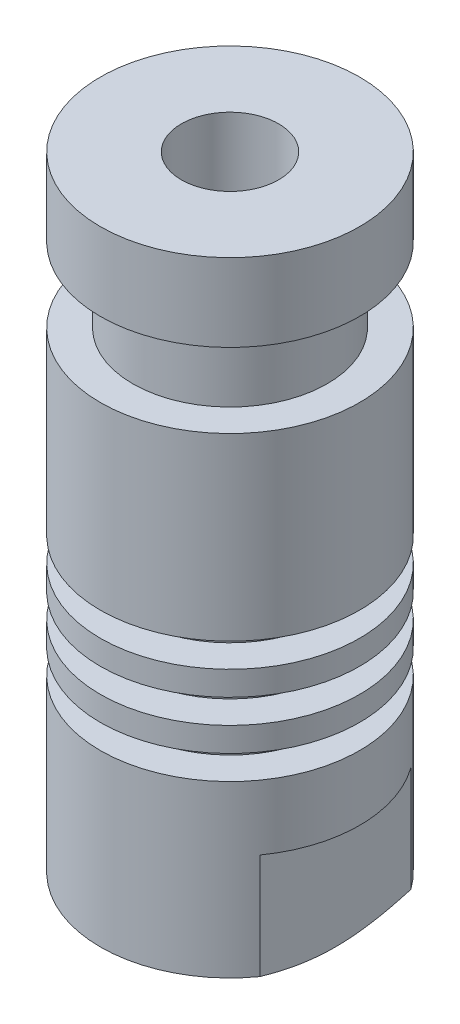
ISO-10303-21;
HEADER;
FILE_DESCRIPTION(('STEP AP214'),'2;1');
FILE_NAME('part.step','',(''),(''),'','','');
FILE_SCHEMA(('AUTOMOTIVE_DESIGN { 1 0 10303 214 1 1 1 1 }'));
ENDSEC;
DATA;
#1=APPLICATION_CONTEXT('core data for automotive mechanical design processes');
#2=APPLICATION_PROTOCOL_DEFINITION('international standard','automotive_design',2000,#1);
#3=PRODUCT_CONTEXT('',#1,'mechanical');
#4=PRODUCT('Part','Part','',(#3));
#5=PRODUCT_RELATED_PRODUCT_CATEGORY('part','',(#4));
#6=PRODUCT_DEFINITION_FORMATION('','',#4);
#7=PRODUCT_DEFINITION_CONTEXT('part definition',#1,'design');
#8=PRODUCT_DEFINITION('design','',#6,#7);
#9=PRODUCT_DEFINITION_SHAPE('','',#8);
#10=(LENGTH_UNIT() NAMED_UNIT(*) SI_UNIT(.MILLI.,.METRE.));
#11=(NAMED_UNIT(*) PLANE_ANGLE_UNIT() SI_UNIT($,.RADIAN.));
#12=(NAMED_UNIT(*) SI_UNIT($,.STERADIAN.) SOLID_ANGLE_UNIT());
#13=UNCERTAINTY_MEASURE_WITH_UNIT(LENGTH_MEASURE(1.E-05),#10,'distance_accuracy_value','');
#14=(GEOMETRIC_REPRESENTATION_CONTEXT(3) GLOBAL_UNCERTAINTY_ASSIGNED_CONTEXT((#13)) GLOBAL_UNIT_ASSIGNED_CONTEXT((#10,
#11,#12)) REPRESENTATION_CONTEXT('',''));
#15=CARTESIAN_POINT('',(0.,0.,0.));
#16=DIRECTION('',(0.,0.,1.));
#17=DIRECTION('',(1.,0.,0.));
#18=AXIS2_PLACEMENT_3D('',#15,#16,#17);
#19=CARTESIAN_POINT('',(0.,1.5,0.));
#20=DIRECTION('',(0.,1.,0.));
#21=DIRECTION('',(0.,0.,1.));
#22=AXIS2_PLACEMENT_3D('',#19,#20,#21);
#23=CONICAL_SURFACE('',#22,7.99999999999999,1.10714871779409);
#24=CARTESIAN_POINT('',(0.,0.,0.));
#25=DIRECTION('',(0.,1.,0.));
#26=DIRECTION('',(0.,0.,1.));
#27=AXIS2_PLACEMENT_3D('',#24,#25,#26);
#28=CIRCLE('',#27,4.99999999999998);
#29=CARTESIAN_POINT('',(0.,0.,4.99999999999998));
#30=VERTEX_POINT('',#29);
#31=EDGE_CURVE('E11',#30,#30,#28,.T.);
#32=ORIENTED_EDGE('',*,*,#31,.T.);
#33=EDGE_LOOP('',(#32));
#34=FACE_BOUND('',#33,.T.);
#35=CARTESIAN_POINT('',(0.,1.5,0.));
#36=DIRECTION('',(0.,1.,0.));
#37=DIRECTION('',(0.,0.,1.));
#38=AXIS2_PLACEMENT_3D('',#35,#36,#37);
#39=CIRCLE('',#38,7.99999999999999);
#40=CARTESIAN_POINT('',(6.49999999999997,1.5,-4.66368952654442));
#41=VERTEX_POINT('',#40);
#42=CARTESIAN_POINT('',(-6.49999999999997,1.5,-4.66368952654442));
#43=VERTEX_POINT('',#42);
#44=EDGE_CURVE('E92',#41,#43,#39,.T.);
#45=ORIENTED_EDGE('',*,*,#44,.F.);
#46=CARTESIAN_POINT('',(6.49999999999999,4.63960517836139,-12.7140020611741));
#47=CARTESIAN_POINT('',(6.49999999999999,4.49493273691476,-12.3889791438294));
#48=CARTESIAN_POINT('',(6.49999999999999,4.35117750702607,-12.0635434352985));
#49=CARTESIAN_POINT('',(6.49999999999999,4.06600795170587,-11.4116234990025));
#50=CARTESIAN_POINT('',(6.49999999999999,3.92459377917146,-11.0851392044028));
#51=CARTESIAN_POINT('',(6.49999999999999,3.64433543055072,-10.4302489102803));
#52=CARTESIAN_POINT('',(6.49999999999999,3.50549732908588,-10.1018403056813));
#53=CARTESIAN_POINT('',(6.49999999999999,3.23142571950738,-9.44352872623451));
#54=CARTESIAN_POINT('',(6.49999999999999,3.09619212071106,-9.11362578922608));
#55=CARTESIAN_POINT('',(6.49999999999999,2.83048289305681,-8.45250376338199));
#56=CARTESIAN_POINT('',(6.49999999999999,2.70000014874712,-8.12128754257229));
#57=CARTESIAN_POINT('',(6.49999999999999,2.44483186701764,-7.45659634827721));
#58=CARTESIAN_POINT('',(6.49999999999999,2.32014667007343,-7.12312124344746));
#59=CARTESIAN_POINT('',(6.49999999999999,2.07840099908305,-6.45372644486896));
#60=CARTESIAN_POINT('',(6.49999999999999,1.96133416663675,-6.11780905674865));
#61=CARTESIAN_POINT('',(6.49999999999999,1.73702665581905,-5.44272397498847));
#62=CARTESIAN_POINT('',(6.49999999999999,1.62978438251793,-5.10355681882979));
#63=CARTESIAN_POINT('',(6.49999999999999,1.50145760944831,-4.66929022803816));
#64=CARTESIAN_POINT('',(6.49999999999999,1.47439812441263,-4.57594563698323));
#65=CARTESIAN_POINT('',(6.49999999999999,1.42132141191772,-4.38896083134469));
#66=CARTESIAN_POINT('',(6.49999999999999,1.39530416853117,-4.29532062130229));
#67=CARTESIAN_POINT('',(6.49999999999999,1.31884649816979,-4.01363447591895));
#68=CARTESIAN_POINT('',(6.49999999999999,1.27009239909997,-3.82513345071698));
#69=CARTESIAN_POINT('',(6.49999999999999,1.13144347216063,-3.25712110004858));
#70=CARTESIAN_POINT('',(6.49999999999999,1.04932049996449,-2.87562365996438));
#71=CARTESIAN_POINT('',(6.49999999999999,0.946261094020701,-2.29977813127616));
#72=CARTESIAN_POINT('',(6.49999999999999,0.915259699355964,-2.10720712065049));
#73=CARTESIAN_POINT('',(6.49999999999999,0.860714592579146,-1.7210183720728));
#74=CARTESIAN_POINT('',(6.49999999999999,0.837170046736164,-1.52740075360301));
#75=CARTESIAN_POINT('',(6.49999999999999,0.798232474629815,-1.13985753736791));
#76=CARTESIAN_POINT('',(6.49999999999999,0.78281812154265,-0.945934097286736));
#77=CARTESIAN_POINT('',(6.49999999999999,0.760510527948946,-0.557594838663115));
#78=CARTESIAN_POINT('',(6.49999999999999,0.753617189046767,-0.363179025832271));
#79=CARTESIAN_POINT('',(6.49999999999999,0.748572275423311,0.0257307608028582));
#80=CARTESIAN_POINT('',(6.49999999999999,0.750419038007415,0.220224712703199));
#81=CARTESIAN_POINT('',(6.49999999999999,0.76278940638265,0.608953775199544));
#82=CARTESIAN_POINT('',(6.49999999999999,0.773314033718197,0.803188852624818));
#83=CARTESIAN_POINT('',(6.49999999999999,0.806501889662758,1.24090602694894));
#84=CARTESIAN_POINT('',(6.49999999999999,0.831590920516132,1.48420561931385));
#85=CARTESIAN_POINT('',(6.49999999999999,0.893852125406738,1.96924724220696));
#86=CARTESIAN_POINT('',(6.49999999999999,0.931025317420885,2.21098913976373));
#87=CARTESIAN_POINT('',(6.49999999999999,1.01604103903786,2.69277716302994));
#88=CARTESIAN_POINT('',(6.49999999999999,1.06389244038228,2.93282170644527));
#89=CARTESIAN_POINT('',(6.49999999999999,1.16871694054054,3.41088019593747));
#90=CARTESIAN_POINT('',(6.49999999999999,1.22568964445531,3.64889422945387));
#91=CARTESIAN_POINT('',(6.49999999999999,1.34820588611418,4.1264246278799));
#92=CARTESIAN_POINT('',(6.49999999999999,1.41386316573231,4.36591159529887));
#93=CARTESIAN_POINT('',(6.49999999999999,1.55170831935892,4.84285142414976));
#94=CARTESIAN_POINT('',(6.49999999999999,1.62389277522808,5.08030527977033));
#95=CARTESIAN_POINT('',(6.49999999999999,1.77367698683179,5.55344813381403));
#96=CARTESIAN_POINT('',(6.49999999999999,1.85127585874315,5.78913741335531));
#97=CARTESIAN_POINT('',(6.49999999999999,2.01097599435672,6.2590172847031));
#98=CARTESIAN_POINT('',(6.49999999999999,2.09307790629008,6.49320765528824));
#99=CARTESIAN_POINT('',(6.49999999999999,2.28703034641471,7.03262988490792));
#100=CARTESIAN_POINT('',(6.49999999999999,2.40021373679549,7.33738166221177));
#101=CARTESIAN_POINT('',(6.49999999999999,2.63161506867892,7.94497276131788));
#102=CARTESIAN_POINT('',(6.49999999999999,2.74983321640616,8.24781200419785));
#103=CARTESIAN_POINT('',(6.49999999999999,2.99028703034095,8.8519169939098));
#104=CARTESIAN_POINT('',(6.49999999999999,3.11252303289466,9.15318260654962));
#105=CARTESIAN_POINT('',(6.49999999999999,3.36022795848007,9.75438363657073));
#106=CARTESIAN_POINT('',(6.49999999999999,3.4856969285348,10.0543190345298));
#107=CARTESIAN_POINT('',(6.49999999999999,3.8662108131295,10.9529295272112));
#108=CARTESIAN_POINT('',(6.49999999999999,4.12517530296346,11.5499439611486));
#109=CARTESIAN_POINT('',(6.49999999999999,4.65016432189855,12.7407935160942));
#110=CARTESIAN_POINT('',(6.49999999999999,4.91618837224115,13.334628849434));
#111=CARTESIAN_POINT('',(6.49999999999999,5.43683739745572,14.4837436524848));
#112=CARTESIAN_POINT('',(6.49999999999999,5.69116368566189,15.0391586745477));
#113=CARTESIAN_POINT('',(6.49999999999999,6.20312748367828,16.148471829484));
#114=CARTESIAN_POINT('',(6.49999999999999,6.46076506083453,16.7023699312269));
#115=CARTESIAN_POINT('',(6.49999999999999,6.97809934492668,17.8080180985776));
#116=CARTESIAN_POINT('',(6.49999999999999,7.23779164660991,18.3597702278274));
#117=CARTESIAN_POINT('',(6.49999999999999,7.75914833515714,19.4623190137403));
#118=CARTESIAN_POINT('',(6.49999999999999,8.02081265352454,20.0131157027799));
#119=CARTESIAN_POINT('',(6.49999999999999,8.28320577924075,20.5635626171586));
#120=B_SPLINE_CURVE_WITH_KNOTS('',3,(#46,#47,#48,#49,#50,#51,#52,#53,#54,#55,#56,#57,#58,#59,
#60,#61,#62,#63,#64,#65,#66,#67,#68,#69,#70,#71,#72,#73,#74,#75,#76,#77,#78,#79,#80,#81,#82,#83,
#84,#85,#86,#87,#88,#89,#90,#91,#92,#93,#94,#95,#96,#97,#98,#99,#100,#101,#102,#103,#104,#105,
#106,#107,#108,#109,#110,#111,#112,#113,#114,#115,#116,#117,#118,#119),.UNSPECIFIED.,.F.,.F.,(4,
2,2,2,2,2,2,2,2,2,2,2,2,2,2,2,2,2,2,2,2,2,2,2,2,2,2,2,2,2,2,2,2,2,2,2,4),(0.,1.06730515758636,
2.13467974924004,3.20431402837474,4.27392137202762,5.34185467005331,6.40985060614333,
7.47694343200912,8.54386271672926,8.83542135077924,9.12697552758702,9.71105511301348,
10.8808525348457,11.4658873460732,12.0508567229673,12.6342839007031,13.2177043413035,
13.8010137979488,14.3843919306593,15.1178129637762,15.8512957967343,16.5853903108169,
17.31945305149,18.0643130987016,18.8087853133975,19.5531362870632,20.2975946957999,
21.2728075860352,22.2480604596634,23.2233951834841,24.1987441014193,26.1509456097113,
28.1030150621006,29.9356240477088,31.7682703646555,33.5977016553135,35.4270696921721),.UNSPECIFIED.);
#121=CARTESIAN_POINT('',(6.49999999999997,1.5,4.66368952654442));
#122=VERTEX_POINT('',#121);
#123=EDGE_CURVE('E77',#122,#41,#120,.F.);
#124=ORIENTED_EDGE('',*,*,#123,.F.);
#125=CARTESIAN_POINT('',(-6.49999999999997,1.5,4.66368952654442));
#126=VERTEX_POINT('',#125);
#127=EDGE_CURVE('E44',#126,#122,#39,.T.);
#128=ORIENTED_EDGE('',*,*,#127,.F.);
#129=CARTESIAN_POINT('',(-6.49999999999999,4.63960517836139,-12.7140020611741));
#130=CARTESIAN_POINT('',(-6.49999999999999,4.49493273691476,-12.3889791438294));
#131=CARTESIAN_POINT('',(-6.49999999999999,4.35117750702607,-12.0635434352985));
#132=CARTESIAN_POINT('',(-6.49999999999999,4.06600795170587,-11.4116234990025));
#133=CARTESIAN_POINT('',(-6.49999999999999,3.92459377917146,-11.0851392044028));
#134=CARTESIAN_POINT('',(-6.49999999999999,3.64433543055072,-10.4302489102803));
#135=CARTESIAN_POINT('',(-6.49999999999999,3.50549732908588,-10.1018403056813));
#136=CARTESIAN_POINT('',(-6.49999999999999,3.23142571950738,-9.44352872623451));
#137=CARTESIAN_POINT('',(-6.49999999999999,3.09619212071106,-9.11362578922608));
#138=CARTESIAN_POINT('',(-6.49999999999999,2.83048289305681,-8.45250376338199));
#139=CARTESIAN_POINT('',(-6.49999999999999,2.70000014874712,-8.12128754257229));
#140=CARTESIAN_POINT('',(-6.49999999999999,2.44483186701764,-7.45659634827721));
#141=CARTESIAN_POINT('',(-6.49999999999999,2.32014667007343,-7.12312124344746));
#142=CARTESIAN_POINT('',(-6.49999999999999,2.07840099908305,-6.45372644486896));
#143=CARTESIAN_POINT('',(-6.49999999999999,1.96133416663675,-6.11780905674865));
#144=CARTESIAN_POINT('',(-6.49999999999999,1.73702665581905,-5.44272397498847));
#145=CARTESIAN_POINT('',(-6.49999999999999,1.62978438251793,-5.10355681882979));
#146=CARTESIAN_POINT('',(-6.49999999999999,1.50145760944831,-4.66929022803816));
#147=CARTESIAN_POINT('',(-6.49999999999999,1.47439812441263,-4.57594563698323));
#148=CARTESIAN_POINT('',(-6.49999999999999,1.42132141191772,-4.38896083134469));
#149=CARTESIAN_POINT('',(-6.49999999999999,1.39530416853117,-4.29532062130229));
#150=CARTESIAN_POINT('',(-6.49999999999999,1.31884649816979,-4.01363447591895));
#151=CARTESIAN_POINT('',(-6.49999999999999,1.27009239909997,-3.82513345071698));
#152=CARTESIAN_POINT('',(-6.49999999999999,1.13144347216063,-3.25712110004858));
#153=CARTESIAN_POINT('',(-6.49999999999999,1.04932049996449,-2.87562365996438));
#154=CARTESIAN_POINT('',(-6.49999999999999,0.946261094020701,-2.29977813127616));
#155=CARTESIAN_POINT('',(-6.49999999999999,0.915259699355964,-2.10720712065049));
#156=CARTESIAN_POINT('',(-6.49999999999999,0.860714592579146,-1.7210183720728));
#157=CARTESIAN_POINT('',(-6.49999999999999,0.837170046736164,-1.52740075360301));
#158=CARTESIAN_POINT('',(-6.49999999999999,0.798232474629815,-1.13985753736791));
#159=CARTESIAN_POINT('',(-6.49999999999999,0.78281812154265,-0.945934097286736));
#160=CARTESIAN_POINT('',(-6.49999999999999,0.760510527948946,-0.557594838663115));
#161=CARTESIAN_POINT('',(-6.49999999999999,0.753617189046767,-0.363179025832271));
#162=CARTESIAN_POINT('',(-6.49999999999999,0.748572275423311,0.0257307608028582));
#163=CARTESIAN_POINT('',(-6.49999999999999,0.750419038007415,0.220224712703199));
#164=CARTESIAN_POINT('',(-6.49999999999999,0.76278940638265,0.608953775199544));
#165=CARTESIAN_POINT('',(-6.49999999999999,0.773314033718197,0.803188852624818));
#166=CARTESIAN_POINT('',(-6.49999999999999,0.806501889662758,1.24090602694894));
#167=CARTESIAN_POINT('',(-6.49999999999999,0.831590920516132,1.48420561931385));
#168=CARTESIAN_POINT('',(-6.49999999999999,0.893852125406738,1.96924724220696));
#169=CARTESIAN_POINT('',(-6.49999999999999,0.931025317420885,2.21098913976373));
#170=CARTESIAN_POINT('',(-6.49999999999999,1.01604103903786,2.69277716302994));
#171=CARTESIAN_POINT('',(-6.49999999999999,1.06389244038228,2.93282170644527));
#172=CARTESIAN_POINT('',(-6.49999999999999,1.16871694054054,3.41088019593747));
#173=CARTESIAN_POINT('',(-6.49999999999999,1.22568964445531,3.64889422945387));
#174=CARTESIAN_POINT('',(-6.49999999999999,1.34820588611418,4.1264246278799));
#175=CARTESIAN_POINT('',(-6.49999999999999,1.41386316573231,4.36591159529887));
#176=CARTESIAN_POINT('',(-6.49999999999999,1.55170831935892,4.84285142414976));
#177=CARTESIAN_POINT('',(-6.49999999999999,1.62389277522808,5.08030527977033));
#178=CARTESIAN_POINT('',(-6.49999999999999,1.77367698683179,5.55344813381403));
#179=CARTESIAN_POINT('',(-6.49999999999999,1.85127585874315,5.78913741335531));
#180=CARTESIAN_POINT('',(-6.49999999999999,2.01097599435672,6.2590172847031));
#181=CARTESIAN_POINT('',(-6.49999999999999,2.09307790629008,6.49320765528824));
#182=CARTESIAN_POINT('',(-6.49999999999999,2.28703034641471,7.03262988490792));
#183=CARTESIAN_POINT('',(-6.49999999999999,2.40021373679549,7.33738166221177));
#184=CARTESIAN_POINT('',(-6.49999999999999,2.63161506867892,7.94497276131788));
#185=CARTESIAN_POINT('',(-6.49999999999999,2.74983321640616,8.24781200419785));
#186=CARTESIAN_POINT('',(-6.49999999999999,2.99028703034095,8.8519169939098));
#187=CARTESIAN_POINT('',(-6.49999999999999,3.11252303289466,9.15318260654962));
#188=CARTESIAN_POINT('',(-6.49999999999999,3.36022795848007,9.75438363657073));
#189=CARTESIAN_POINT('',(-6.49999999999999,3.4856969285348,10.0543190345298));
#190=CARTESIAN_POINT('',(-6.49999999999999,3.8662108131295,10.9529295272112));
#191=CARTESIAN_POINT('',(-6.49999999999999,4.12517530296346,11.5499439611486));
#192=CARTESIAN_POINT('',(-6.49999999999999,4.65016432189855,12.7407935160942));
#193=CARTESIAN_POINT('',(-6.49999999999999,4.91618837224115,13.334628849434));
#194=CARTESIAN_POINT('',(-6.49999999999999,5.43683739745572,14.4837436524848));
#195=CARTESIAN_POINT('',(-6.49999999999999,5.69116368566189,15.0391586745477));
#196=CARTESIAN_POINT('',(-6.49999999999999,6.20312748367828,16.148471829484));
#197=CARTESIAN_POINT('',(-6.49999999999999,6.46076506083453,16.7023699312269));
#198=CARTESIAN_POINT('',(-6.49999999999999,6.97809934492668,17.8080180985776));
#199=CARTESIAN_POINT('',(-6.49999999999999,7.23779164660991,18.3597702278274));
#200=CARTESIAN_POINT('',(-6.49999999999999,7.75914833515714,19.4623190137403));
#201=CARTESIAN_POINT('',(-6.49999999999999,8.02081265352454,20.0131157027799));
#202=CARTESIAN_POINT('',(-6.49999999999999,8.28320577924075,20.5635626171586));
#203=B_SPLINE_CURVE_WITH_KNOTS('',3,(#129,#130,#131,#132,#133,#134,#135,#136,#137,#138,#139,
#140,#141,#142,#143,#144,#145,#146,#147,#148,#149,#150,#151,#152,#153,#154,#155,#156,#157,#158,
#159,#160,#161,#162,#163,#164,#165,#166,#167,#168,#169,#170,#171,#172,#173,#174,#175,#176,#177,
#178,#179,#180,#181,#182,#183,#184,#185,#186,#187,#188,#189,#190,#191,#192,#193,#194,#195,#196,
#197,#198,#199,#200,#201,#202),.UNSPECIFIED.,.F.,.F.,(4,2,2,2,2,2,2,2,2,2,2,2,2,2,2,2,2,2,2,2,2,
2,2,2,2,2,2,2,2,2,2,2,2,2,2,2,4),(0.,1.06730515758636,2.13467974924004,3.20431402837474,
4.27392137202762,5.34185467005331,6.40985060614333,7.47694343200912,8.54386271672926,
8.83542135077924,9.12697552758702,9.71105511301348,10.8808525348457,11.4658873460732,
12.0508567229673,12.6342839007031,13.2177043413035,13.8010137979488,14.3843919306593,
15.1178129637762,15.8512957967343,16.5853903108169,17.31945305149,18.0643130987016,
18.8087853133975,19.5531362870632,20.2975946957999,21.2728075860352,22.2480604596634,
23.2233951834841,24.1987441014193,26.1509456097113,28.1030150621006,29.9356240477088,
31.7682703646555,33.5977016553135,35.4270696921721),.UNSPECIFIED.);
#204=EDGE_CURVE('E97',#43,#126,#203,.T.);
#205=ORIENTED_EDGE('',*,*,#204,.F.);
#206=EDGE_LOOP('',(#45,#124,#128,#205));
#207=FACE_BOUND('',#206,.T.);
#208=ADVANCED_FACE('F35',(#34,#207),#23,.T.);
#209=CARTESIAN_POINT('',(0.,129.407380346339,0.));
#210=DIRECTION('',(0.,1.,0.));
#211=DIRECTION('',(0.,0.,1.));
#212=AXIS2_PLACEMENT_3D('',#209,#210,#211);
#213=CYLINDRICAL_SURFACE('',#212,7.99999999999999);
#214=CARTESIAN_POINT('',(0.,12.,0.));
#215=DIRECTION('',(0.,1.,0.));
#216=DIRECTION('',(0.,0.,1.));
#217=AXIS2_PLACEMENT_3D('',#214,#215,#216);
#218=CIRCLE('',#217,7.99999999999998);
#219=CARTESIAN_POINT('',(0.,12.,7.99999999999998));
#220=VERTEX_POINT('',#219);
#221=EDGE_CURVE('E98',#220,#220,#218,.T.);
#222=ORIENTED_EDGE('',*,*,#221,.F.);
#223=EDGE_LOOP('',(#222));
#224=FACE_BOUND('',#223,.T.);
#225=CARTESIAN_POINT('',(0.,7.99999999999999,0.));
#226=DIRECTION('',(0.,-1.,0.));
#227=DIRECTION('',(0.,0.,-1.));
#228=AXIS2_PLACEMENT_3D('',#225,#226,#227);
#229=CIRCLE('',#228,7.99999999999999);
#230=CARTESIAN_POINT('',(6.49999999999999,7.99999999999999,-4.6636895265444));
#231=VERTEX_POINT('',#230);
#232=CARTESIAN_POINT('',(6.49999999999997,7.99999999999999,4.66368952654442));
#233=VERTEX_POINT('',#232);
#234=EDGE_CURVE('E50',#231,#233,#229,.T.);
#235=ORIENTED_EDGE('',*,*,#234,.F.);
#236=DIRECTION('',(0.,1.,0.));
#237=VECTOR('',#236,1.);
#238=CARTESIAN_POINT('',(6.49999999999997,129.407380346339,-4.66368952654442));
#239=LINE('',#238,#237);
#240=EDGE_CURVE('E80',#231,#41,#239,.F.);
#241=ORIENTED_EDGE('',*,*,#240,.T.);
#242=ORIENTED_EDGE('',*,*,#44,.T.);
#243=DIRECTION('',(0.,1.,0.));
#244=VECTOR('',#243,1.);
#245=CARTESIAN_POINT('',(-6.49999999999997,129.407380346339,-4.66368952654442));
#246=LINE('',#245,#244);
#247=CARTESIAN_POINT('',(-6.49999999999999,7.99999999999999,-4.6636895265444));
#248=VERTEX_POINT('',#247);
#249=EDGE_CURVE('E456',#43,#248,#246,.T.);
#250=ORIENTED_EDGE('',*,*,#249,.T.);
#251=CARTESIAN_POINT('',(0.,7.99999999999998,0.));
#252=DIRECTION('',(0.,-1.,0.));
#253=DIRECTION('',(1.,0.,0.));
#254=AXIS2_PLACEMENT_3D('',#251,#252,#253);
#255=CIRCLE('',#254,7.99999999999999);
#256=CARTESIAN_POINT('',(-6.49999999999999,7.99999999999999,4.6636895265444));
#257=VERTEX_POINT('',#256);
#258=EDGE_CURVE('E457',#257,#248,#255,.T.);
#259=ORIENTED_EDGE('',*,*,#258,.F.);
#260=DIRECTION('',(0.,1.,0.));
#261=VECTOR('',#260,1.);
#262=CARTESIAN_POINT('',(-6.49999999999997,129.407380346339,4.66368952654442));
#263=LINE('',#262,#261);
#264=EDGE_CURVE('E58',#126,#257,#263,.T.);
#265=ORIENTED_EDGE('',*,*,#264,.F.);
#266=ORIENTED_EDGE('',*,*,#127,.T.);
#267=DIRECTION('',(0.,1.,0.));
#268=VECTOR('',#267,1.);
#269=CARTESIAN_POINT('',(6.49999999999997,129.407380346339,4.66368952654442));
#270=LINE('',#269,#268);
#271=EDGE_CURVE('E82',#233,#122,#270,.F.);
#272=ORIENTED_EDGE('',*,*,#271,.F.);
#273=EDGE_LOOP('',(#235,#241,#242,#250,#259,#265,#266,#272));
#274=FACE_BOUND('',#273,.T.);
#275=ADVANCED_FACE('F90',(#224,#274),#213,.T.);
#276=CARTESIAN_POINT('',(0.,0.,0.));
#277=DIRECTION('',(0.,-1.,0.));
#278=DIRECTION('',(0.,0.,-1.));
#279=AXIS2_PLACEMENT_3D('',#276,#277,#278);
#280=PLANE('',#279);
#281=CARTESIAN_POINT('',(0.,0.,0.));
#282=DIRECTION('',(0.,-1.,0.));
#283=DIRECTION('',(0.,0.,-1.));
#284=AXIS2_PLACEMENT_3D('',#281,#282,#283);
#285=CIRCLE('',#284,3.39999999999999);
#286=CARTESIAN_POINT('',(0.,0.,-3.39999999999999));
#287=VERTEX_POINT('',#286);
#288=EDGE_CURVE('E297',#287,#287,#285,.T.);
#289=ORIENTED_EDGE('',*,*,#288,.F.);
#290=EDGE_LOOP('',(#289));
#291=FACE_BOUND('',#290,.T.);
#292=ORIENTED_EDGE('',*,*,#31,.F.);
#293=EDGE_LOOP('',(#292));
#294=FACE_BOUND('',#293,.T.);
#295=ADVANCED_FACE('F37',(#291,#294),#280,.T.);
#296=CARTESIAN_POINT('',(-7.99999999999998,12.,0.));
#297=DIRECTION('',(0.,1.,0.));
#298=DIRECTION('',(0.,0.,1.));
#299=AXIS2_PLACEMENT_3D('',#296,#297,#298);
#300=PLANE('',#299);
#301=ORIENTED_EDGE('',*,*,#221,.T.);
#302=EDGE_LOOP('',(#301));
#303=FACE_BOUND('',#302,.T.);
#304=CARTESIAN_POINT('',(0.,12.,0.));
#305=DIRECTION('',(0.,1.,0.));
#306=DIRECTION('',(0.,0.,1.));
#307=AXIS2_PLACEMENT_3D('',#304,#305,#306);
#308=CIRCLE('',#307,5.99999999999998);
#309=CARTESIAN_POINT('',(0.,12.,5.99999999999998));
#310=VERTEX_POINT('',#309);
#311=EDGE_CURVE('E101',#310,#310,#308,.T.);
#312=ORIENTED_EDGE('',*,*,#311,.F.);
#313=EDGE_LOOP('',(#312));
#314=FACE_BOUND('',#313,.T.);
#315=ADVANCED_FACE('F185',(#303,#314),#300,.T.);
#316=CARTESIAN_POINT('',(0.,129.407380346339,0.));
#317=DIRECTION('',(0.,1.,0.));
#318=DIRECTION('',(0.,0.,1.));
#319=AXIS2_PLACEMENT_3D('',#316,#317,#318);
#320=CYLINDRICAL_SURFACE('',#319,5.99999999999999);
#321=ORIENTED_EDGE('',*,*,#311,.T.);
#322=EDGE_LOOP('',(#321));
#323=FACE_BOUND('',#322,.T.);
#324=CARTESIAN_POINT('',(0.,13.5,0.));
#325=DIRECTION('',(0.,1.,0.));
#326=DIRECTION('',(0.,0.,1.));
#327=AXIS2_PLACEMENT_3D('',#324,#325,#326);
#328=CIRCLE('',#327,6.);
#329=CARTESIAN_POINT('',(0.,13.5,6.));
#330=VERTEX_POINT('',#329);
#331=EDGE_CURVE('E106',#330,#330,#328,.T.);
#332=ORIENTED_EDGE('',*,*,#331,.F.);
#333=EDGE_LOOP('',(#332));
#334=FACE_BOUND('',#333,.T.);
#335=ADVANCED_FACE('F188',(#323,#334),#320,.T.);
#336=CARTESIAN_POINT('',(-6.,13.5,0.));
#337=DIRECTION('',(0.,-1.,0.));
#338=DIRECTION('',(0.,0.,-1.));
#339=AXIS2_PLACEMENT_3D('',#336,#337,#338);
#340=PLANE('',#339);
#341=ORIENTED_EDGE('',*,*,#331,.T.);
#342=EDGE_LOOP('',(#341));
#343=FACE_BOUND('',#342,.T.);
#344=CARTESIAN_POINT('',(0.,13.5,0.));
#345=DIRECTION('',(0.,1.,0.));
#346=DIRECTION('',(0.,0.,1.));
#347=AXIS2_PLACEMENT_3D('',#344,#345,#346);
#348=CIRCLE('',#347,8.);
#349=CARTESIAN_POINT('',(0.,13.5,8.));
#350=VERTEX_POINT('',#349);
#351=EDGE_CURVE('E109',#350,#350,#348,.T.);
#352=ORIENTED_EDGE('',*,*,#351,.F.);
#353=EDGE_LOOP('',(#352));
#354=FACE_BOUND('',#353,.T.);
#355=ADVANCED_FACE('F192',(#343,#354),#340,.T.);
#356=CARTESIAN_POINT('',(0.,129.407380346339,0.));
#357=DIRECTION('',(0.,1.,0.));
#358=DIRECTION('',(0.,0.,1.));
#359=AXIS2_PLACEMENT_3D('',#356,#357,#358);
#360=CYLINDRICAL_SURFACE('',#359,8.);
#361=ORIENTED_EDGE('',*,*,#351,.T.);
#362=EDGE_LOOP('',(#361));
#363=FACE_BOUND('',#362,.T.);
#364=CARTESIAN_POINT('',(0.,15.,0.));
#365=DIRECTION('',(0.,1.,0.));
#366=DIRECTION('',(0.,0.,1.));
#367=AXIS2_PLACEMENT_3D('',#364,#365,#366);
#368=CIRCLE('',#367,8.);
#369=CARTESIAN_POINT('',(0.,15.,8.));
#370=VERTEX_POINT('',#369);
#371=EDGE_CURVE('E112',#370,#370,#368,.T.);
#372=ORIENTED_EDGE('',*,*,#371,.F.);
#373=EDGE_LOOP('',(#372));
#374=FACE_BOUND('',#373,.T.);
#375=ADVANCED_FACE('F196',(#363,#374),#360,.T.);
#376=CARTESIAN_POINT('',(-8.,15.,0.));
#377=DIRECTION('',(0.,1.,0.));
#378=DIRECTION('',(0.,0.,1.));
#379=AXIS2_PLACEMENT_3D('',#376,#377,#378);
#380=PLANE('',#379);
#381=ORIENTED_EDGE('',*,*,#371,.T.);
#382=EDGE_LOOP('',(#381));
#383=FACE_BOUND('',#382,.T.);
#384=CARTESIAN_POINT('',(0.,15.,0.));
#385=DIRECTION('',(0.,1.,0.));
#386=DIRECTION('',(0.,0.,1.));
#387=AXIS2_PLACEMENT_3D('',#384,#385,#386);
#388=CIRCLE('',#387,6.);
#389=CARTESIAN_POINT('',(0.,15.,6.));
#390=VERTEX_POINT('',#389);
#391=EDGE_CURVE('E115',#390,#390,#388,.T.);
#392=ORIENTED_EDGE('',*,*,#391,.F.);
#393=EDGE_LOOP('',(#392));
#394=FACE_BOUND('',#393,.T.);
#395=ADVANCED_FACE('F200',(#383,#394),#380,.T.);
#396=CARTESIAN_POINT('',(0.,129.407380346339,0.));
#397=DIRECTION('',(0.,1.,0.));
#398=DIRECTION('',(0.,0.,1.));
#399=AXIS2_PLACEMENT_3D('',#396,#397,#398);
#400=CYLINDRICAL_SURFACE('',#399,6.);
#401=ORIENTED_EDGE('',*,*,#391,.T.);
#402=EDGE_LOOP('',(#401));
#403=FACE_BOUND('',#402,.T.);
#404=CARTESIAN_POINT('',(0.,16.5,0.));
#405=DIRECTION('',(0.,1.,0.));
#406=DIRECTION('',(0.,0.,1.));
#407=AXIS2_PLACEMENT_3D('',#404,#405,#406);
#408=CIRCLE('',#407,6.);
#409=CARTESIAN_POINT('',(0.,16.5,6.));
#410=VERTEX_POINT('',#409);
#411=EDGE_CURVE('E118',#410,#410,#408,.T.);
#412=ORIENTED_EDGE('',*,*,#411,.F.);
#413=EDGE_LOOP('',(#412));
#414=FACE_BOUND('',#413,.T.);
#415=ADVANCED_FACE('F204',(#403,#414),#400,.T.);
#416=CARTESIAN_POINT('',(-6.,16.5,0.));
#417=DIRECTION('',(0.,-1.,0.));
#418=DIRECTION('',(0.,0.,-1.));
#419=AXIS2_PLACEMENT_3D('',#416,#417,#418);
#420=PLANE('',#419);
#421=ORIENTED_EDGE('',*,*,#411,.T.);
#422=EDGE_LOOP('',(#421));
#423=FACE_BOUND('',#422,.T.);
#424=CARTESIAN_POINT('',(0.,16.5,0.));
#425=DIRECTION('',(0.,1.,0.));
#426=DIRECTION('',(0.,0.,1.));
#427=AXIS2_PLACEMENT_3D('',#424,#425,#426);
#428=CIRCLE('',#427,8.);
#429=CARTESIAN_POINT('',(0.,16.5,8.));
#430=VERTEX_POINT('',#429);
#431=EDGE_CURVE('E121',#430,#430,#428,.T.);
#432=ORIENTED_EDGE('',*,*,#431,.F.);
#433=EDGE_LOOP('',(#432));
#434=FACE_BOUND('',#433,.T.);
#435=ADVANCED_FACE('F208',(#423,#434),#420,.T.);
#436=CARTESIAN_POINT('',(0.,129.407380346339,0.));
#437=DIRECTION('',(0.,1.,0.));
#438=DIRECTION('',(0.,0.,1.));
#439=AXIS2_PLACEMENT_3D('',#436,#437,#438);
#440=CYLINDRICAL_SURFACE('',#439,8.);
#441=ORIENTED_EDGE('',*,*,#431,.T.);
#442=EDGE_LOOP('',(#441));
#443=FACE_BOUND('',#442,.T.);
#444=CARTESIAN_POINT('',(0.,18.,0.));
#445=DIRECTION('',(0.,1.,0.));
#446=DIRECTION('',(0.,0.,1.));
#447=AXIS2_PLACEMENT_3D('',#444,#445,#446);
#448=CIRCLE('',#447,8.);
#449=CARTESIAN_POINT('',(0.,18.,8.));
#450=VERTEX_POINT('',#449);
#451=EDGE_CURVE('E124',#450,#450,#448,.T.);
#452=ORIENTED_EDGE('',*,*,#451,.F.);
#453=EDGE_LOOP('',(#452));
#454=FACE_BOUND('',#453,.T.);
#455=ADVANCED_FACE('F212',(#443,#454),#440,.T.);
#456=CARTESIAN_POINT('',(-8.,18.,0.));
#457=DIRECTION('',(0.,1.,0.));
#458=DIRECTION('',(0.,0.,1.));
#459=AXIS2_PLACEMENT_3D('',#456,#457,#458);
#460=PLANE('',#459);
#461=ORIENTED_EDGE('',*,*,#451,.T.);
#462=EDGE_LOOP('',(#461));
#463=FACE_BOUND('',#462,.T.);
#464=CARTESIAN_POINT('',(0.,18.,0.));
#465=DIRECTION('',(0.,1.,0.));
#466=DIRECTION('',(0.,0.,1.));
#467=AXIS2_PLACEMENT_3D('',#464,#465,#466);
#468=CIRCLE('',#467,6.);
#469=CARTESIAN_POINT('',(0.,18.,6.));
#470=VERTEX_POINT('',#469);
#471=EDGE_CURVE('E127',#470,#470,#468,.T.);
#472=ORIENTED_EDGE('',*,*,#471,.F.);
#473=EDGE_LOOP('',(#472));
#474=FACE_BOUND('',#473,.T.);
#475=ADVANCED_FACE('F216',(#463,#474),#460,.T.);
#476=CARTESIAN_POINT('',(0.,129.407380346339,0.));
#477=DIRECTION('',(0.,1.,0.));
#478=DIRECTION('',(0.,0.,1.));
#479=AXIS2_PLACEMENT_3D('',#476,#477,#478);
#480=CYLINDRICAL_SURFACE('',#479,6.);
#481=ORIENTED_EDGE('',*,*,#471,.T.);
#482=EDGE_LOOP('',(#481));
#483=FACE_BOUND('',#482,.T.);
#484=CARTESIAN_POINT('',(0.,19.5,0.));
#485=DIRECTION('',(0.,1.,0.));
#486=DIRECTION('',(0.,0.,1.));
#487=AXIS2_PLACEMENT_3D('',#484,#485,#486);
#488=CIRCLE('',#487,6.);
#489=CARTESIAN_POINT('',(0.,19.5,6.));
#490=VERTEX_POINT('',#489);
#491=EDGE_CURVE('E130',#490,#490,#488,.T.);
#492=ORIENTED_EDGE('',*,*,#491,.F.);
#493=EDGE_LOOP('',(#492));
#494=FACE_BOUND('',#493,.T.);
#495=ADVANCED_FACE('F220',(#483,#494),#480,.T.);
#496=CARTESIAN_POINT('',(-6.,19.5,0.));
#497=DIRECTION('',(0.,-1.,0.));
#498=DIRECTION('',(0.,0.,-1.));
#499=AXIS2_PLACEMENT_3D('',#496,#497,#498);
#500=PLANE('',#499);
#501=ORIENTED_EDGE('',*,*,#491,.T.);
#502=EDGE_LOOP('',(#501));
#503=FACE_BOUND('',#502,.T.);
#504=CARTESIAN_POINT('',(0.,19.5,0.));
#505=DIRECTION('',(0.,1.,0.));
#506=DIRECTION('',(0.,0.,1.));
#507=AXIS2_PLACEMENT_3D('',#504,#505,#506);
#508=CIRCLE('',#507,8.);
#509=CARTESIAN_POINT('',(0.,19.5,8.));
#510=VERTEX_POINT('',#509);
#511=EDGE_CURVE('E133',#510,#510,#508,.T.);
#512=ORIENTED_EDGE('',*,*,#511,.F.);
#513=EDGE_LOOP('',(#512));
#514=FACE_BOUND('',#513,.T.);
#515=ADVANCED_FACE('F224',(#503,#514),#500,.T.);
#516=CARTESIAN_POINT('',(0.,129.407380346339,0.));
#517=DIRECTION('',(0.,1.,0.));
#518=DIRECTION('',(0.,0.,1.));
#519=AXIS2_PLACEMENT_3D('',#516,#517,#518);
#520=CYLINDRICAL_SURFACE('',#519,8.);
#521=ORIENTED_EDGE('',*,*,#511,.T.);
#522=EDGE_LOOP('',(#521));
#523=FACE_BOUND('',#522,.T.);
#524=CARTESIAN_POINT('',(0.,30.6,0.));
#525=DIRECTION('',(0.,1.,0.));
#526=DIRECTION('',(0.,0.,1.));
#527=AXIS2_PLACEMENT_3D('',#524,#525,#526);
#528=CIRCLE('',#527,8.);
#529=CARTESIAN_POINT('',(0.,30.6,8.));
#530=VERTEX_POINT('',#529);
#531=EDGE_CURVE('E136',#530,#530,#528,.T.);
#532=ORIENTED_EDGE('',*,*,#531,.F.);
#533=EDGE_LOOP('',(#532));
#534=FACE_BOUND('',#533,.T.);
#535=ADVANCED_FACE('F228',(#523,#534),#520,.T.);
#536=CARTESIAN_POINT('',(-8.,30.6,0.));
#537=DIRECTION('',(0.,1.,0.));
#538=DIRECTION('',(0.,0.,1.));
#539=AXIS2_PLACEMENT_3D('',#536,#537,#538);
#540=PLANE('',#539);
#541=ORIENTED_EDGE('',*,*,#531,.T.);
#542=EDGE_LOOP('',(#541));
#543=FACE_BOUND('',#542,.T.);
#544=CARTESIAN_POINT('',(0.,30.6,0.));
#545=DIRECTION('',(0.,1.,0.));
#546=DIRECTION('',(0.,0.,1.));
#547=AXIS2_PLACEMENT_3D('',#544,#545,#546);
#548=CIRCLE('',#547,6.);
#549=CARTESIAN_POINT('',(0.,30.6,6.));
#550=VERTEX_POINT('',#549);
#551=EDGE_CURVE('E139',#550,#550,#548,.T.);
#552=ORIENTED_EDGE('',*,*,#551,.F.);
#553=EDGE_LOOP('',(#552));
#554=FACE_BOUND('',#553,.T.);
#555=ADVANCED_FACE('F232',(#543,#554),#540,.T.);
#556=CARTESIAN_POINT('',(0.,129.407380346339,0.));
#557=DIRECTION('',(0.,1.,0.));
#558=DIRECTION('',(0.,0.,1.));
#559=AXIS2_PLACEMENT_3D('',#556,#557,#558);
#560=CYLINDRICAL_SURFACE('',#559,6.);
#561=ORIENTED_EDGE('',*,*,#551,.T.);
#562=EDGE_LOOP('',(#561));
#563=FACE_BOUND('',#562,.T.);
#564=CARTESIAN_POINT('',(0.,35.2,0.));
#565=DIRECTION('',(0.,1.,0.));
#566=DIRECTION('',(0.,0.,1.));
#567=AXIS2_PLACEMENT_3D('',#564,#565,#566);
#568=CIRCLE('',#567,6.);
#569=CARTESIAN_POINT('',(0.,35.2,6.));
#570=VERTEX_POINT('',#569);
#571=EDGE_CURVE('E142',#570,#570,#568,.T.);
#572=ORIENTED_EDGE('',*,*,#571,.F.);
#573=EDGE_LOOP('',(#572));
#574=FACE_BOUND('',#573,.T.);
#575=ADVANCED_FACE('F236',(#563,#574),#560,.T.);
#576=CARTESIAN_POINT('',(-6.,35.2,0.));
#577=DIRECTION('',(0.,-1.,0.));
#578=DIRECTION('',(0.,0.,-1.));
#579=AXIS2_PLACEMENT_3D('',#576,#577,#578);
#580=PLANE('',#579);
#581=ORIENTED_EDGE('',*,*,#571,.T.);
#582=EDGE_LOOP('',(#581));
#583=FACE_BOUND('',#582,.T.);
#584=CARTESIAN_POINT('',(0.,35.2,0.));
#585=DIRECTION('',(0.,1.,0.));
#586=DIRECTION('',(0.,0.,1.));
#587=AXIS2_PLACEMENT_3D('',#584,#585,#586);
#588=CIRCLE('',#587,8.);
#589=CARTESIAN_POINT('',(0.,35.2,8.));
#590=VERTEX_POINT('',#589);
#591=EDGE_CURVE('E145',#590,#590,#588,.T.);
#592=ORIENTED_EDGE('',*,*,#591,.F.);
#593=EDGE_LOOP('',(#592));
#594=FACE_BOUND('',#593,.T.);
#595=ADVANCED_FACE('F240',(#583,#594),#580,.T.);
#596=CARTESIAN_POINT('',(0.,129.407380346339,0.));
#597=DIRECTION('',(0.,1.,0.));
#598=DIRECTION('',(0.,0.,1.));
#599=AXIS2_PLACEMENT_3D('',#596,#597,#598);
#600=CYLINDRICAL_SURFACE('',#599,7.99999999999999);
#601=ORIENTED_EDGE('',*,*,#591,.T.);
#602=EDGE_LOOP('',(#601));
#603=FACE_BOUND('',#602,.T.);
#604=CARTESIAN_POINT('',(0.,40.,0.));
#605=DIRECTION('',(0.,1.,0.));
#606=DIRECTION('',(0.,0.,1.));
#607=AXIS2_PLACEMENT_3D('',#604,#605,#606);
#608=CIRCLE('',#607,7.99999999999998);
#609=CARTESIAN_POINT('',(0.,40.,7.99999999999998));
#610=VERTEX_POINT('',#609);
#611=EDGE_CURVE('E148',#610,#610,#608,.T.);
#612=ORIENTED_EDGE('',*,*,#611,.F.);
#613=EDGE_LOOP('',(#612));
#614=FACE_BOUND('',#613,.T.);
#615=ADVANCED_FACE('F244',(#603,#614),#600,.T.);
#616=CARTESIAN_POINT('',(-7.99999999999998,40.,0.));
#617=DIRECTION('',(0.,1.,0.));
#618=DIRECTION('',(0.,0.,1.));
#619=AXIS2_PLACEMENT_3D('',#616,#617,#618);
#620=PLANE('',#619);
#621=CARTESIAN_POINT('',(0.,40.,0.));
#622=DIRECTION('',(0.,1.,0.));
#623=DIRECTION('',(0.,0.,1.));
#624=AXIS2_PLACEMENT_3D('',#621,#622,#623);
#625=CIRCLE('',#624,3.);
#626=CARTESIAN_POINT('',(0.,40.,3.));
#627=VERTEX_POINT('',#626);
#628=EDGE_CURVE('E94',#627,#627,#625,.T.);
#629=ORIENTED_EDGE('',*,*,#628,.F.);
#630=EDGE_LOOP('',(#629));
#631=FACE_BOUND('',#630,.T.);
#632=ORIENTED_EDGE('',*,*,#611,.T.);
#633=EDGE_LOOP('',(#632));
#634=FACE_BOUND('',#633,.T.);
#635=ADVANCED_FACE('F175',(#631,#634),#620,.T.);
#636=CARTESIAN_POINT('',(-6.49999999999999,7.99999999999999,8.001));
#637=DIRECTION('',(-1.,0.,0.));
#638=DIRECTION('',(0.,-1.,0.));
#639=AXIS2_PLACEMENT_3D('',#636,#637,#638);
#640=PLANE('',#639);
#641=ORIENTED_EDGE('',*,*,#204,.T.);
#642=ORIENTED_EDGE('',*,*,#264,.T.);
#643=DIRECTION('',(0.,0.,-1.));
#644=VECTOR('',#643,1.);
#645=CARTESIAN_POINT('',(-6.49999999999999,7.99999999999999,8.001));
#646=LINE('',#645,#644);
#647=EDGE_CURVE('E151',#257,#248,#646,.T.);
#648=ORIENTED_EDGE('',*,*,#647,.T.);
#649=ORIENTED_EDGE('',*,*,#249,.F.);
#650=EDGE_LOOP('',(#641,#642,#648,#649));
#651=FACE_BOUND('',#650,.T.);
#652=ADVANCED_FACE('F160',(#651),#640,.T.);
#653=CARTESIAN_POINT('',(-7.99999999999999,7.99999999999999,8.001));
#654=DIRECTION('',(0.,-1.,0.));
#655=DIRECTION('',(1.,0.,0.));
#656=AXIS2_PLACEMENT_3D('',#653,#654,#655);
#657=PLANE('',#656);
#658=ORIENTED_EDGE('',*,*,#258,.T.);
#659=ORIENTED_EDGE('',*,*,#647,.F.);
#660=EDGE_LOOP('',(#658,#659));
#661=FACE_BOUND('',#660,.T.);
#662=ADVANCED_FACE('F168',(#661),#657,.T.);
#663=CARTESIAN_POINT('',(7.99999999999999,7.99999999999999,8.001));
#664=DIRECTION('',(0.,-1.,0.));
#665=DIRECTION('',(0.,0.,-1.));
#666=AXIS2_PLACEMENT_3D('',#663,#664,#665);
#667=PLANE('',#666);
#668=ORIENTED_EDGE('',*,*,#234,.T.);
#669=DIRECTION('',(0.,0.,-1.));
#670=VECTOR('',#669,1.);
#671=CARTESIAN_POINT('',(6.49999999999999,7.99999999999999,8.001));
#672=LINE('',#671,#670);
#673=EDGE_CURVE('E87',#233,#231,#672,.T.);
#674=ORIENTED_EDGE('',*,*,#673,.T.);
#675=EDGE_LOOP('',(#668,#674));
#676=FACE_BOUND('',#675,.T.);
#677=ADVANCED_FACE('F166',(#676),#667,.T.);
#678=CARTESIAN_POINT('',(6.49999999999999,7.99999999999999,8.001));
#679=DIRECTION('',(1.,0.,0.));
#680=DIRECTION('',(0.,1.,0.));
#681=AXIS2_PLACEMENT_3D('',#678,#679,#680);
#682=PLANE('',#681);
#683=ORIENTED_EDGE('',*,*,#123,.T.);
#684=ORIENTED_EDGE('',*,*,#240,.F.);
#685=ORIENTED_EDGE('',*,*,#673,.F.);
#686=ORIENTED_EDGE('',*,*,#271,.T.);
#687=EDGE_LOOP('',(#683,#684,#685,#686));
#688=FACE_BOUND('',#687,.T.);
#689=ADVANCED_FACE('F79',(#688),#682,.T.);
#690=CARTESIAN_POINT('',(0.,0.,0.));
#691=DIRECTION('',(0.,1.,0.));
#692=DIRECTION('',(0.,0.,1.));
#693=AXIS2_PLACEMENT_3D('',#690,#691,#692);
#694=CYLINDRICAL_SURFACE('',#693,3.);
#695=CARTESIAN_POINT('',(0.,12.240344247611,0.));
#696=DIRECTION('',(0.,-1.,0.));
#697=DIRECTION('',(0.,0.,-1.));
#698=AXIS2_PLACEMENT_3D('',#695,#696,#697);
#699=CIRCLE('',#698,3.);
#700=CARTESIAN_POINT('',(0.,12.240344247611,-3.));
#701=VERTEX_POINT('',#700);
#702=EDGE_CURVE('E39',#701,#701,#699,.T.);
#703=ORIENTED_EDGE('',*,*,#702,.T.);
#704=EDGE_LOOP('',(#703));
#705=FACE_BOUND('',#704,.T.);
#706=ORIENTED_EDGE('',*,*,#628,.T.);
#707=EDGE_LOOP('',(#706));
#708=FACE_BOUND('',#707,.T.);
#709=ADVANCED_FACE('F275',(#705,#708),#694,.F.);
#710=CARTESIAN_POINT('',(0.,12.,0.));
#711=DIRECTION('',(0.,-1.,0.));
#712=DIRECTION('',(0.,0.,-1.));
#713=AXIS2_PLACEMENT_3D('',#710,#711,#712);
#714=CONICAL_SURFACE('',#713,3.4,1.02974425867665);
#715=CARTESIAN_POINT('',(0.,12.,0.));
#716=DIRECTION('',(0.,-1.,0.));
#717=DIRECTION('',(0.,0.,-1.));
#718=AXIS2_PLACEMENT_3D('',#715,#716,#717);
#719=CIRCLE('',#718,3.4);
#720=CARTESIAN_POINT('',(0.,12.,-3.4));
#721=VERTEX_POINT('',#720);
#722=EDGE_CURVE('E260',#721,#721,#719,.T.);
#723=ORIENTED_EDGE('',*,*,#722,.T.);
#724=EDGE_LOOP('',(#723));
#725=FACE_BOUND('',#724,.T.);
#726=ORIENTED_EDGE('',*,*,#702,.F.);
#727=EDGE_LOOP('',(#726));
#728=FACE_BOUND('',#727,.T.);
#729=ADVANCED_FACE('F279',(#725,#728),#714,.F.);
#730=CARTESIAN_POINT('',(0.,0.,0.));
#731=DIRECTION('',(0.,-1.,0.));
#732=DIRECTION('',(0.,0.,-1.));
#733=AXIS2_PLACEMENT_3D('',#730,#731,#732);
#734=CYLINDRICAL_SURFACE('',#733,3.39999999999999);
#735=ORIENTED_EDGE('',*,*,#722,.F.);
#736=EDGE_LOOP('',(#735));
#737=FACE_BOUND('',#736,.T.);
#738=ORIENTED_EDGE('',*,*,#288,.T.);
#739=EDGE_LOOP('',(#738));
#740=FACE_BOUND('',#739,.T.);
#741=ADVANCED_FACE('F284',(#737,#740),#734,.F.);
#742=CLOSED_SHELL('',(#208,#275,#295,#315,#335,#355,#375,#395,#415,#435,#455,#475,#495,#515,
#535,#555,#575,#595,#615,#635,#652,#662,#677,#689,#709,#729,#741));
#743=MANIFOLD_SOLID_BREP('B2',#742);
#744=ADVANCED_BREP_SHAPE_REPRESENTATION('',(#18,#743),#14);
#745=SHAPE_DEFINITION_REPRESENTATION(#9,#744);
ENDSEC;
END-ISO-10303-21;
